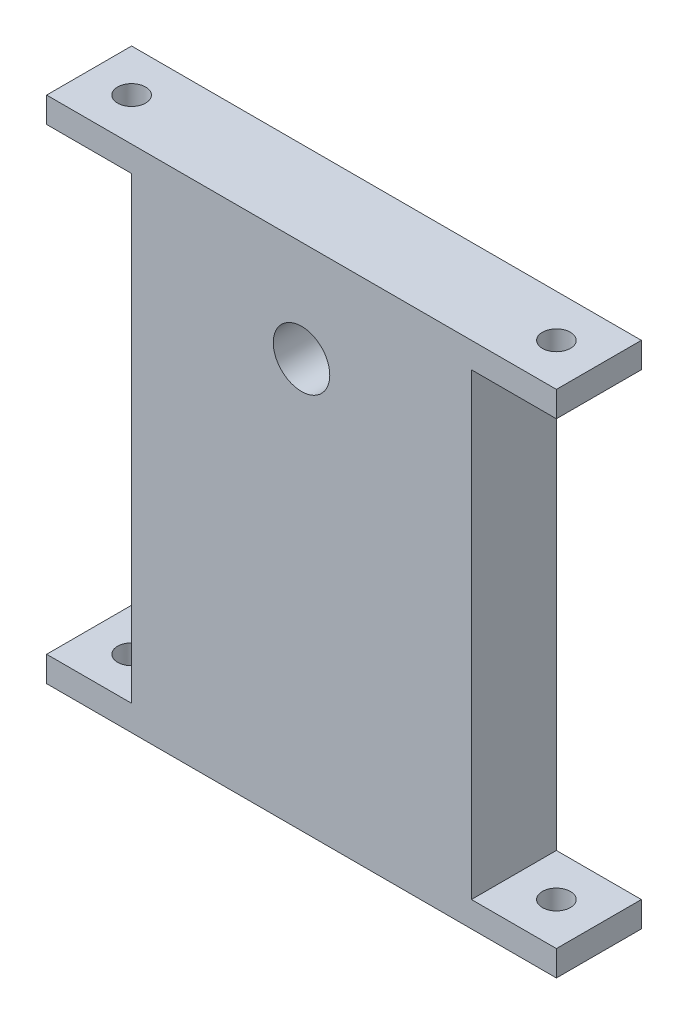
ISO-10303-21;
HEADER;
FILE_DESCRIPTION(('STEP AP214'),'2;1');
FILE_NAME('part.step','',(''),(''),'','','');
FILE_SCHEMA(('AUTOMOTIVE_DESIGN { 1 0 10303 214 1 1 1 1 }'));
ENDSEC;
DATA;
#1=APPLICATION_CONTEXT('core data for automotive mechanical design processes');
#2=APPLICATION_PROTOCOL_DEFINITION('international standard','automotive_design',2000,#1);
#3=PRODUCT_CONTEXT('',#1,'mechanical');
#4=PRODUCT('Part','Part','',(#3));
#5=PRODUCT_RELATED_PRODUCT_CATEGORY('part','',(#4));
#6=PRODUCT_DEFINITION_FORMATION('','',#4);
#7=PRODUCT_DEFINITION_CONTEXT('part definition',#1,'design');
#8=PRODUCT_DEFINITION('design','',#6,#7);
#9=PRODUCT_DEFINITION_SHAPE('','',#8);
#10=(LENGTH_UNIT() NAMED_UNIT(*) SI_UNIT(.MILLI.,.METRE.));
#11=(NAMED_UNIT(*) PLANE_ANGLE_UNIT() SI_UNIT($,.RADIAN.));
#12=(NAMED_UNIT(*) SI_UNIT($,.STERADIAN.) SOLID_ANGLE_UNIT());
#13=UNCERTAINTY_MEASURE_WITH_UNIT(LENGTH_MEASURE(1.E-05),#10,'distance_accuracy_value','');
#14=(GEOMETRIC_REPRESENTATION_CONTEXT(3) GLOBAL_UNCERTAINTY_ASSIGNED_CONTEXT((#13)) GLOBAL_UNIT_ASSIGNED_CONTEXT((#10,
#11,#12)) REPRESENTATION_CONTEXT('',''));
#15=CARTESIAN_POINT('',(0.,0.,0.));
#16=DIRECTION('',(0.,0.,1.));
#17=DIRECTION('',(1.,0.,0.));
#18=AXIS2_PLACEMENT_3D('',#15,#16,#17);
#19=CARTESIAN_POINT('',(-20.,30.,10.));
#20=DIRECTION('',(1.,0.,0.));
#21=DIRECTION('',(0.,1.,0.));
#22=AXIS2_PLACEMENT_3D('',#19,#20,#21);
#23=PLANE('',#22);
#24=DIRECTION('',(0.,0.,-1.));
#25=VECTOR('',#24,1.);
#26=CARTESIAN_POINT('',(-20.,-27.,0.));
#27=LINE('',#26,#25);
#28=CARTESIAN_POINT('',(-20.,-27.,10.));
#29=VERTEX_POINT('',#28);
#30=CARTESIAN_POINT('',(-20.,-27.,0.));
#31=VERTEX_POINT('',#30);
#32=EDGE_CURVE('E130',#29,#31,#27,.T.);
#33=ORIENTED_EDGE('',*,*,#32,.F.);
#34=DIRECTION('',(0.,-1.,0.));
#35=VECTOR('',#34,1.);
#36=CARTESIAN_POINT('',(-20.,30.,10.));
#37=LINE('',#36,#35);
#38=CARTESIAN_POINT('',(-20.,27.,10.));
#39=VERTEX_POINT('',#38);
#40=EDGE_CURVE('E48',#39,#29,#37,.T.);
#41=ORIENTED_EDGE('',*,*,#40,.F.);
#42=DIRECTION('',(0.,0.,1.));
#43=VECTOR('',#42,1.);
#44=CARTESIAN_POINT('',(-20.,27.,10.));
#45=LINE('',#44,#43);
#46=CARTESIAN_POINT('',(-20.,27.,0.));
#47=VERTEX_POINT('',#46);
#48=EDGE_CURVE('E56',#47,#39,#45,.T.);
#49=ORIENTED_EDGE('',*,*,#48,.F.);
#50=DIRECTION('',(0.,-1.,0.));
#51=VECTOR('',#50,1.);
#52=CARTESIAN_POINT('',(-20.,30.,0.));
#53=LINE('',#52,#51);
#54=EDGE_CURVE('E146',#47,#31,#53,.T.);
#55=ORIENTED_EDGE('',*,*,#54,.T.);
#56=EDGE_LOOP('',(#33,#41,#49,#55));
#57=FACE_BOUND('',#56,.T.);
#58=ADVANCED_FACE('F39',(#57),#23,.F.);
#59=CARTESIAN_POINT('',(20.,30.,10.));
#60=DIRECTION('',(-1.,0.,0.));
#61=DIRECTION('',(0.,-1.,0.));
#62=AXIS2_PLACEMENT_3D('',#59,#60,#61);
#63=PLANE('',#62);
#64=DIRECTION('',(0.,0.,1.));
#65=VECTOR('',#64,1.);
#66=CARTESIAN_POINT('',(20.,-27.,0.));
#67=LINE('',#66,#65);
#68=CARTESIAN_POINT('',(20.,-27.,0.));
#69=VERTEX_POINT('',#68);
#70=CARTESIAN_POINT('',(20.,-27.,10.));
#71=VERTEX_POINT('',#70);
#72=EDGE_CURVE('E215',#69,#71,#67,.T.);
#73=ORIENTED_EDGE('',*,*,#72,.F.);
#74=DIRECTION('',(0.,1.,0.));
#75=VECTOR('',#74,1.);
#76=CARTESIAN_POINT('',(20.,30.,0.));
#77=LINE('',#76,#75);
#78=CARTESIAN_POINT('',(20.,27.,0.));
#79=VERTEX_POINT('',#78);
#80=EDGE_CURVE('E155',#69,#79,#77,.T.);
#81=ORIENTED_EDGE('',*,*,#80,.T.);
#82=DIRECTION('',(0.,0.,-1.));
#83=VECTOR('',#82,1.);
#84=CARTESIAN_POINT('',(20.,27.,10.));
#85=LINE('',#84,#83);
#86=CARTESIAN_POINT('',(20.,27.,10.));
#87=VERTEX_POINT('',#86);
#88=EDGE_CURVE('E217',#87,#79,#85,.T.);
#89=ORIENTED_EDGE('',*,*,#88,.F.);
#90=DIRECTION('',(0.,1.,0.));
#91=VECTOR('',#90,1.);
#92=CARTESIAN_POINT('',(20.,30.,10.));
#93=LINE('',#92,#91);
#94=EDGE_CURVE('E64',#71,#87,#93,.T.);
#95=ORIENTED_EDGE('',*,*,#94,.F.);
#96=EDGE_LOOP('',(#73,#81,#89,#95));
#97=FACE_BOUND('',#96,.T.);
#98=ADVANCED_FACE('F41',(#97),#63,.F.);
#99=CARTESIAN_POINT('',(0.,0.,10.));
#100=DIRECTION('',(0.,0.,1.));
#101=DIRECTION('',(1.,0.,0.));
#102=AXIS2_PLACEMENT_3D('',#99,#100,#101);
#103=PLANE('',#102);
#104=DIRECTION('',(1.,0.,0.));
#105=VECTOR('',#104,1.);
#106=CARTESIAN_POINT('',(-20.,-30.,10.));
#107=LINE('',#106,#105);
#108=CARTESIAN_POINT('',(-30.,-30.,10.));
#109=VERTEX_POINT('',#108);
#110=CARTESIAN_POINT('',(30.,-30.,10.));
#111=VERTEX_POINT('',#110);
#112=EDGE_CURVE('E11',#109,#111,#107,.T.);
#113=ORIENTED_EDGE('',*,*,#112,.T.);
#114=DIRECTION('',(0.,-1.,0.));
#115=VECTOR('',#114,1.);
#116=CARTESIAN_POINT('',(30.,-27.,10.));
#117=LINE('',#116,#115);
#118=CARTESIAN_POINT('',(30.,-27.,10.));
#119=VERTEX_POINT('',#118);
#120=EDGE_CURVE('E214',#119,#111,#117,.T.);
#121=ORIENTED_EDGE('',*,*,#120,.F.);
#122=DIRECTION('',(-1.,0.,0.));
#123=VECTOR('',#122,1.);
#124=CARTESIAN_POINT('',(30.,-27.,10.));
#125=LINE('',#124,#123);
#126=EDGE_CURVE('E211',#119,#71,#125,.T.);
#127=ORIENTED_EDGE('',*,*,#126,.T.);
#128=ORIENTED_EDGE('',*,*,#94,.T.);
#129=DIRECTION('',(-1.,0.,0.));
#130=VECTOR('',#129,1.);
#131=CARTESIAN_POINT('',(30.,27.,10.));
#132=LINE('',#131,#130);
#133=CARTESIAN_POINT('',(30.,27.,10.));
#134=VERTEX_POINT('',#133);
#135=EDGE_CURVE('E242',#134,#87,#132,.T.);
#136=ORIENTED_EDGE('',*,*,#135,.F.);
#137=DIRECTION('',(0.,-1.,0.));
#138=VECTOR('',#137,1.);
#139=CARTESIAN_POINT('',(30.,30.,10.));
#140=LINE('',#139,#138);
#141=CARTESIAN_POINT('',(30.,30.,10.));
#142=VERTEX_POINT('',#141);
#143=EDGE_CURVE('E233',#142,#134,#140,.T.);
#144=ORIENTED_EDGE('',*,*,#143,.F.);
#145=DIRECTION('',(-1.,0.,0.));
#146=VECTOR('',#145,1.);
#147=CARTESIAN_POINT('',(-20.,30.,10.));
#148=LINE('',#147,#146);
#149=CARTESIAN_POINT('',(-30.,30.,10.));
#150=VERTEX_POINT('',#149);
#151=EDGE_CURVE('E252',#142,#150,#148,.T.);
#152=ORIENTED_EDGE('',*,*,#151,.T.);
#153=DIRECTION('',(0.,1.,0.));
#154=VECTOR('',#153,1.);
#155=CARTESIAN_POINT('',(-30.,30.,10.));
#156=LINE('',#155,#154);
#157=CARTESIAN_POINT('',(-30.,27.,10.));
#158=VERTEX_POINT('',#157);
#159=EDGE_CURVE('E196',#158,#150,#156,.T.);
#160=ORIENTED_EDGE('',*,*,#159,.F.);
#161=DIRECTION('',(1.,0.,0.));
#162=VECTOR('',#161,1.);
#163=CARTESIAN_POINT('',(-30.,27.,10.));
#164=LINE('',#163,#162);
#165=EDGE_CURVE('E202',#158,#39,#164,.T.);
#166=ORIENTED_EDGE('',*,*,#165,.T.);
#167=ORIENTED_EDGE('',*,*,#40,.T.);
#168=DIRECTION('',(1.,0.,0.));
#169=VECTOR('',#168,1.);
#170=CARTESIAN_POINT('',(-30.,-27.,10.));
#171=LINE('',#170,#169);
#172=CARTESIAN_POINT('',(-30.,-27.,10.));
#173=VERTEX_POINT('',#172);
#174=EDGE_CURVE('E137',#173,#29,#171,.T.);
#175=ORIENTED_EDGE('',*,*,#174,.F.);
#176=DIRECTION('',(0.,1.,0.));
#177=VECTOR('',#176,1.);
#178=CARTESIAN_POINT('',(-30.,-30.,10.));
#179=LINE('',#178,#177);
#180=EDGE_CURVE('E185',#109,#173,#179,.T.);
#181=ORIENTED_EDGE('',*,*,#180,.F.);
#182=EDGE_LOOP('',(#113,#121,#127,#128,#136,#144,#152,#160,#166,#167,#175,#181));
#183=FACE_BOUND('',#182,.T.);
#184=CARTESIAN_POINT('',(0.,18.11,10.));
#185=DIRECTION('',(0.,0.,1.));
#186=DIRECTION('',(1.,0.,0.));
#187=AXIS2_PLACEMENT_3D('',#184,#185,#186);
#188=CIRCLE('',#187,3.325);
#189=CARTESIAN_POINT('',(3.325,18.11,10.));
#190=VERTEX_POINT('',#189);
#191=EDGE_CURVE('E246',#190,#190,#188,.T.);
#192=ORIENTED_EDGE('',*,*,#191,.F.);
#193=EDGE_LOOP('',(#192));
#194=FACE_BOUND('',#193,.T.);
#195=ADVANCED_FACE('F267',(#183,#194),#103,.T.);
#196=CARTESIAN_POINT('',(0.,0.,0.));
#197=DIRECTION('',(0.,0.,1.));
#198=DIRECTION('',(1.,0.,0.));
#199=AXIS2_PLACEMENT_3D('',#196,#197,#198);
#200=PLANE('',#199);
#201=ORIENTED_EDGE('',*,*,#80,.F.);
#202=DIRECTION('',(-1.,0.,0.));
#203=VECTOR('',#202,1.);
#204=CARTESIAN_POINT('',(30.,-27.,0.));
#205=LINE('',#204,#203);
#206=CARTESIAN_POINT('',(30.,-27.,0.));
#207=VERTEX_POINT('',#206);
#208=EDGE_CURVE('E208',#207,#69,#205,.T.);
#209=ORIENTED_EDGE('',*,*,#208,.F.);
#210=DIRECTION('',(0.,1.,0.));
#211=VECTOR('',#210,1.);
#212=CARTESIAN_POINT('',(30.,-30.,0.));
#213=LINE('',#212,#211);
#214=CARTESIAN_POINT('',(30.,-30.,0.));
#215=VERTEX_POINT('',#214);
#216=EDGE_CURVE('E223',#215,#207,#213,.T.);
#217=ORIENTED_EDGE('',*,*,#216,.F.);
#218=DIRECTION('',(1.,0.,0.));
#219=VECTOR('',#218,1.);
#220=CARTESIAN_POINT('',(-20.,-30.,0.));
#221=LINE('',#220,#219);
#222=CARTESIAN_POINT('',(-30.,-30.,0.));
#223=VERTEX_POINT('',#222);
#224=EDGE_CURVE('E151',#223,#215,#221,.T.);
#225=ORIENTED_EDGE('',*,*,#224,.F.);
#226=DIRECTION('',(0.,-1.,0.));
#227=VECTOR('',#226,1.);
#228=CARTESIAN_POINT('',(-30.,-30.,0.));
#229=LINE('',#228,#227);
#230=CARTESIAN_POINT('',(-30.,-27.,0.));
#231=VERTEX_POINT('',#230);
#232=EDGE_CURVE('E139',#231,#223,#229,.T.);
#233=ORIENTED_EDGE('',*,*,#232,.F.);
#234=DIRECTION('',(1.,0.,0.));
#235=VECTOR('',#234,1.);
#236=CARTESIAN_POINT('',(-30.,-27.,0.));
#237=LINE('',#236,#235);
#238=EDGE_CURVE('E134',#231,#31,#237,.T.);
#239=ORIENTED_EDGE('',*,*,#238,.T.);
#240=ORIENTED_EDGE('',*,*,#54,.F.);
#241=DIRECTION('',(1.,0.,0.));
#242=VECTOR('',#241,1.);
#243=CARTESIAN_POINT('',(-30.,27.,0.));
#244=LINE('',#243,#242);
#245=CARTESIAN_POINT('',(-30.,27.,0.));
#246=VERTEX_POINT('',#245);
#247=EDGE_CURVE('E206',#246,#47,#244,.T.);
#248=ORIENTED_EDGE('',*,*,#247,.F.);
#249=DIRECTION('',(0.,-1.,0.));
#250=VECTOR('',#249,1.);
#251=CARTESIAN_POINT('',(-30.,27.,0.));
#252=LINE('',#251,#250);
#253=CARTESIAN_POINT('',(-30.,30.,0.));
#254=VERTEX_POINT('',#253);
#255=EDGE_CURVE('E191',#254,#246,#252,.T.);
#256=ORIENTED_EDGE('',*,*,#255,.F.);
#257=DIRECTION('',(-1.,0.,0.));
#258=VECTOR('',#257,1.);
#259=CARTESIAN_POINT('',(-20.,30.,0.));
#260=LINE('',#259,#258);
#261=CARTESIAN_POINT('',(30.,30.,0.));
#262=VERTEX_POINT('',#261);
#263=EDGE_CURVE('E152',#262,#254,#260,.T.);
#264=ORIENTED_EDGE('',*,*,#263,.F.);
#265=DIRECTION('',(0.,1.,0.));
#266=VECTOR('',#265,1.);
#267=CARTESIAN_POINT('',(30.,27.,0.));
#268=LINE('',#267,#266);
#269=CARTESIAN_POINT('',(30.,27.,0.));
#270=VERTEX_POINT('',#269);
#271=EDGE_CURVE('E227',#270,#262,#268,.T.);
#272=ORIENTED_EDGE('',*,*,#271,.F.);
#273=DIRECTION('',(-1.,0.,0.));
#274=VECTOR('',#273,1.);
#275=CARTESIAN_POINT('',(30.,27.,0.));
#276=LINE('',#275,#274);
#277=EDGE_CURVE('E237',#270,#79,#276,.T.);
#278=ORIENTED_EDGE('',*,*,#277,.T.);
#279=EDGE_LOOP('',(#201,#209,#217,#225,#233,#239,#240,#248,#256,#264,#272,#278));
#280=FACE_BOUND('',#279,.T.);
#281=CARTESIAN_POINT('',(0.,18.11,0.));
#282=DIRECTION('',(0.,0.,1.));
#283=DIRECTION('',(1.,0.,0.));
#284=AXIS2_PLACEMENT_3D('',#281,#282,#283);
#285=CIRCLE('',#284,3.325);
#286=CARTESIAN_POINT('',(3.325,18.11,0.));
#287=VERTEX_POINT('',#286);
#288=EDGE_CURVE('E245',#287,#287,#285,.T.);
#289=ORIENTED_EDGE('',*,*,#288,.T.);
#290=EDGE_LOOP('',(#289));
#291=FACE_BOUND('',#290,.T.);
#292=ADVANCED_FACE('F143',(#280,#291),#200,.F.);
#293=CARTESIAN_POINT('',(-20.,30.,10.));
#294=DIRECTION('',(0.,-1.,0.));
#295=DIRECTION('',(0.,0.,-1.));
#296=AXIS2_PLACEMENT_3D('',#293,#294,#295);
#297=PLANE('',#296);
#298=CARTESIAN_POINT('',(-25.,30.,5.));
#299=DIRECTION('',(0.,-1.,0.));
#300=DIRECTION('',(1.,0.,0.));
#301=AXIS2_PLACEMENT_3D('',#298,#299,#300);
#302=CIRCLE('',#301,1.65);
#303=CARTESIAN_POINT('',(-23.35,30.,5.));
#304=VERTEX_POINT('',#303);
#305=EDGE_CURVE('E161',#304,#304,#302,.T.);
#306=ORIENTED_EDGE('',*,*,#305,.T.);
#307=EDGE_LOOP('',(#306));
#308=FACE_BOUND('',#307,.T.);
#309=CARTESIAN_POINT('',(25.,30.,5.));
#310=DIRECTION('',(0.,-1.,0.));
#311=DIRECTION('',(-1.,0.,0.));
#312=AXIS2_PLACEMENT_3D('',#309,#310,#311);
#313=CIRCLE('',#312,1.65);
#314=CARTESIAN_POINT('',(23.35,30.,5.));
#315=VERTEX_POINT('',#314);
#316=EDGE_CURVE('E175',#315,#315,#313,.T.);
#317=ORIENTED_EDGE('',*,*,#316,.T.);
#318=EDGE_LOOP('',(#317));
#319=FACE_BOUND('',#318,.T.);
#320=ORIENTED_EDGE('',*,*,#263,.T.);
#321=DIRECTION('',(0.,0.,-1.));
#322=VECTOR('',#321,1.);
#323=CARTESIAN_POINT('',(-30.,30.,0.));
#324=LINE('',#323,#322);
#325=EDGE_CURVE('E199',#150,#254,#324,.T.);
#326=ORIENTED_EDGE('',*,*,#325,.F.);
#327=ORIENTED_EDGE('',*,*,#151,.F.);
#328=DIRECTION('',(0.,0.,1.));
#329=VECTOR('',#328,1.);
#330=CARTESIAN_POINT('',(30.,30.,0.));
#331=LINE('',#330,#329);
#332=EDGE_CURVE('E230',#262,#142,#331,.T.);
#333=ORIENTED_EDGE('',*,*,#332,.F.);
#334=EDGE_LOOP('',(#320,#326,#327,#333));
#335=FACE_BOUND('',#334,.T.);
#336=ADVANCED_FACE('F292',(#308,#319,#335),#297,.F.);
#337=CARTESIAN_POINT('',(-20.,-30.,10.));
#338=DIRECTION('',(0.,1.,0.));
#339=DIRECTION('',(-1.,0.,0.));
#340=AXIS2_PLACEMENT_3D('',#337,#338,#339);
#341=PLANE('',#340);
#342=CARTESIAN_POINT('',(-25.,-30.,5.));
#343=DIRECTION('',(0.,-1.,0.));
#344=DIRECTION('',(1.,0.,0.));
#345=AXIS2_PLACEMENT_3D('',#342,#343,#344);
#346=CIRCLE('',#345,1.65);
#347=CARTESIAN_POINT('',(-23.35,-30.,5.));
#348=VERTEX_POINT('',#347);
#349=EDGE_CURVE('E167',#348,#348,#346,.T.);
#350=ORIENTED_EDGE('',*,*,#349,.F.);
#351=EDGE_LOOP('',(#350));
#352=FACE_BOUND('',#351,.T.);
#353=CARTESIAN_POINT('',(25.,-30.,5.));
#354=DIRECTION('',(0.,-1.,0.));
#355=DIRECTION('',(-1.,0.,0.));
#356=AXIS2_PLACEMENT_3D('',#353,#354,#355);
#357=CIRCLE('',#356,1.65);
#358=CARTESIAN_POINT('',(23.35,-30.,5.));
#359=VERTEX_POINT('',#358);
#360=EDGE_CURVE('E172',#359,#359,#357,.T.);
#361=ORIENTED_EDGE('',*,*,#360,.F.);
#362=EDGE_LOOP('',(#361));
#363=FACE_BOUND('',#362,.T.);
#364=ORIENTED_EDGE('',*,*,#224,.T.);
#365=DIRECTION('',(0.,0.,-1.));
#366=VECTOR('',#365,1.);
#367=CARTESIAN_POINT('',(30.,-30.,10.));
#368=LINE('',#367,#366);
#369=EDGE_CURVE('E218',#111,#215,#368,.T.);
#370=ORIENTED_EDGE('',*,*,#369,.F.);
#371=ORIENTED_EDGE('',*,*,#112,.F.);
#372=DIRECTION('',(0.,0.,1.));
#373=VECTOR('',#372,1.);
#374=CARTESIAN_POINT('',(-30.,-30.,0.));
#375=LINE('',#374,#373);
#376=EDGE_CURVE('E187',#223,#109,#375,.T.);
#377=ORIENTED_EDGE('',*,*,#376,.F.);
#378=EDGE_LOOP('',(#364,#370,#371,#377));
#379=FACE_BOUND('',#378,.T.);
#380=ADVANCED_FACE('F280',(#352,#363,#379),#341,.F.);
#381=CARTESIAN_POINT('',(0.,18.11,10.));
#382=DIRECTION('',(0.,0.,-1.));
#383=DIRECTION('',(-1.,0.,0.));
#384=AXIS2_PLACEMENT_3D('',#381,#382,#383);
#385=CYLINDRICAL_SURFACE('',#384,3.325);
#386=ORIENTED_EDGE('',*,*,#191,.T.);
#387=EDGE_LOOP('',(#386));
#388=FACE_BOUND('',#387,.T.);
#389=ORIENTED_EDGE('',*,*,#288,.F.);
#390=EDGE_LOOP('',(#389));
#391=FACE_BOUND('',#390,.T.);
#392=ADVANCED_FACE('F298',(#388,#391),#385,.F.);
#393=CARTESIAN_POINT('',(30.,27.,10.));
#394=DIRECTION('',(0.,1.,0.));
#395=DIRECTION('',(-1.,0.,0.));
#396=AXIS2_PLACEMENT_3D('',#393,#394,#395);
#397=PLANE('',#396);
#398=CARTESIAN_POINT('',(25.,27.,5.));
#399=DIRECTION('',(0.,1.,0.));
#400=DIRECTION('',(-1.,0.,0.));
#401=AXIS2_PLACEMENT_3D('',#398,#399,#400);
#402=CIRCLE('',#401,1.65);
#403=CARTESIAN_POINT('',(23.35,27.,5.));
#404=VERTEX_POINT('',#403);
#405=EDGE_CURVE('E180',#404,#404,#402,.T.);
#406=ORIENTED_EDGE('',*,*,#405,.T.);
#407=EDGE_LOOP('',(#406));
#408=FACE_BOUND('',#407,.T.);
#409=ORIENTED_EDGE('',*,*,#88,.T.);
#410=ORIENTED_EDGE('',*,*,#277,.F.);
#411=DIRECTION('',(0.,0.,-1.));
#412=VECTOR('',#411,1.);
#413=CARTESIAN_POINT('',(30.,27.,10.));
#414=LINE('',#413,#412);
#415=EDGE_CURVE('E235',#134,#270,#414,.T.);
#416=ORIENTED_EDGE('',*,*,#415,.F.);
#417=ORIENTED_EDGE('',*,*,#135,.T.);
#418=EDGE_LOOP('',(#409,#410,#416,#417));
#419=FACE_BOUND('',#418,.T.);
#420=ADVANCED_FACE('F257',(#408,#419),#397,.F.);
#421=CARTESIAN_POINT('',(30.,0.,0.));
#422=DIRECTION('',(1.,0.,0.));
#423=DIRECTION('',(0.,0.,-1.));
#424=AXIS2_PLACEMENT_3D('',#421,#422,#423);
#425=PLANE('',#424);
#426=ORIENTED_EDGE('',*,*,#271,.T.);
#427=ORIENTED_EDGE('',*,*,#332,.T.);
#428=ORIENTED_EDGE('',*,*,#143,.T.);
#429=ORIENTED_EDGE('',*,*,#415,.T.);
#430=EDGE_LOOP('',(#426,#427,#428,#429));
#431=FACE_BOUND('',#430,.T.);
#432=ADVANCED_FACE('F264',(#431),#425,.T.);
#433=CARTESIAN_POINT('',(30.,-27.,0.));
#434=DIRECTION('',(0.,-1.,0.));
#435=DIRECTION('',(1.,0.,0.));
#436=AXIS2_PLACEMENT_3D('',#433,#434,#435);
#437=PLANE('',#436);
#438=CARTESIAN_POINT('',(25.,-27.,5.));
#439=DIRECTION('',(0.,-1.,0.));
#440=DIRECTION('',(1.,0.,0.));
#441=AXIS2_PLACEMENT_3D('',#438,#439,#440);
#442=CIRCLE('',#441,1.65);
#443=CARTESIAN_POINT('',(26.65,-27.,5.));
#444=VERTEX_POINT('',#443);
#445=EDGE_CURVE('E43',#444,#444,#442,.T.);
#446=ORIENTED_EDGE('',*,*,#445,.T.);
#447=EDGE_LOOP('',(#446));
#448=FACE_BOUND('',#447,.T.);
#449=ORIENTED_EDGE('',*,*,#72,.T.);
#450=ORIENTED_EDGE('',*,*,#126,.F.);
#451=DIRECTION('',(0.,0.,1.));
#452=VECTOR('',#451,1.);
#453=CARTESIAN_POINT('',(30.,-27.,0.));
#454=LINE('',#453,#452);
#455=EDGE_CURVE('E221',#207,#119,#454,.T.);
#456=ORIENTED_EDGE('',*,*,#455,.F.);
#457=ORIENTED_EDGE('',*,*,#208,.T.);
#458=EDGE_LOOP('',(#449,#450,#456,#457));
#459=FACE_BOUND('',#458,.T.);
#460=ADVANCED_FACE('F273',(#448,#459),#437,.F.);
#461=CARTESIAN_POINT('',(30.,0.,0.));
#462=DIRECTION('',(1.,0.,0.));
#463=DIRECTION('',(0.,0.,-1.));
#464=AXIS2_PLACEMENT_3D('',#461,#462,#463);
#465=PLANE('',#464);
#466=ORIENTED_EDGE('',*,*,#369,.T.);
#467=ORIENTED_EDGE('',*,*,#216,.T.);
#468=ORIENTED_EDGE('',*,*,#455,.T.);
#469=ORIENTED_EDGE('',*,*,#120,.T.);
#470=EDGE_LOOP('',(#466,#467,#468,#469));
#471=FACE_BOUND('',#470,.T.);
#472=ADVANCED_FACE('F278',(#471),#465,.T.);
#473=CARTESIAN_POINT('',(-30.,27.,10.));
#474=DIRECTION('',(0.,1.,0.));
#475=DIRECTION('',(-1.,0.,0.));
#476=AXIS2_PLACEMENT_3D('',#473,#474,#475);
#477=PLANE('',#476);
#478=CARTESIAN_POINT('',(-25.,27.,5.));
#479=DIRECTION('',(0.,1.,0.));
#480=DIRECTION('',(-1.,0.,0.));
#481=AXIS2_PLACEMENT_3D('',#478,#479,#480);
#482=CIRCLE('',#481,1.65);
#483=CARTESIAN_POINT('',(-26.65,27.,5.));
#484=VERTEX_POINT('',#483);
#485=EDGE_CURVE('E160',#484,#484,#482,.T.);
#486=ORIENTED_EDGE('',*,*,#485,.T.);
#487=EDGE_LOOP('',(#486));
#488=FACE_BOUND('',#487,.T.);
#489=ORIENTED_EDGE('',*,*,#48,.T.);
#490=ORIENTED_EDGE('',*,*,#165,.F.);
#491=DIRECTION('',(0.,0.,1.));
#492=VECTOR('',#491,1.);
#493=CARTESIAN_POINT('',(-30.,27.,10.));
#494=LINE('',#493,#492);
#495=EDGE_CURVE('E194',#246,#158,#494,.T.);
#496=ORIENTED_EDGE('',*,*,#495,.F.);
#497=ORIENTED_EDGE('',*,*,#247,.T.);
#498=EDGE_LOOP('',(#489,#490,#496,#497));
#499=FACE_BOUND('',#498,.T.);
#500=ADVANCED_FACE('F287',(#488,#499),#477,.F.);
#501=CARTESIAN_POINT('',(-30.,0.,0.));
#502=DIRECTION('',(1.,0.,0.));
#503=DIRECTION('',(0.,0.,-1.));
#504=AXIS2_PLACEMENT_3D('',#501,#502,#503);
#505=PLANE('',#504);
#506=ORIENTED_EDGE('',*,*,#255,.T.);
#507=ORIENTED_EDGE('',*,*,#495,.T.);
#508=ORIENTED_EDGE('',*,*,#159,.T.);
#509=ORIENTED_EDGE('',*,*,#325,.T.);
#510=EDGE_LOOP('',(#506,#507,#508,#509));
#511=FACE_BOUND('',#510,.T.);
#512=ADVANCED_FACE('F289',(#511),#505,.F.);
#513=CARTESIAN_POINT('',(-30.,-27.,0.));
#514=DIRECTION('',(0.,-1.,0.));
#515=DIRECTION('',(1.,0.,0.));
#516=AXIS2_PLACEMENT_3D('',#513,#514,#515);
#517=PLANE('',#516);
#518=CARTESIAN_POINT('',(-25.,-27.,5.));
#519=DIRECTION('',(0.,-1.,0.));
#520=DIRECTION('',(1.,0.,0.));
#521=AXIS2_PLACEMENT_3D('',#518,#519,#520);
#522=CIRCLE('',#521,1.65);
#523=CARTESIAN_POINT('',(-23.35,-27.,5.));
#524=VERTEX_POINT('',#523);
#525=EDGE_CURVE('E158',#524,#524,#522,.T.);
#526=ORIENTED_EDGE('',*,*,#525,.T.);
#527=EDGE_LOOP('',(#526));
#528=FACE_BOUND('',#527,.T.);
#529=ORIENTED_EDGE('',*,*,#32,.T.);
#530=ORIENTED_EDGE('',*,*,#238,.F.);
#531=DIRECTION('',(0.,0.,-1.));
#532=VECTOR('',#531,1.);
#533=CARTESIAN_POINT('',(-30.,-27.,0.));
#534=LINE('',#533,#532);
#535=EDGE_CURVE('E149',#173,#231,#534,.T.);
#536=ORIENTED_EDGE('',*,*,#535,.F.);
#537=ORIENTED_EDGE('',*,*,#174,.T.);
#538=EDGE_LOOP('',(#529,#530,#536,#537));
#539=FACE_BOUND('',#538,.T.);
#540=ADVANCED_FACE('F132',(#528,#539),#517,.F.);
#541=CARTESIAN_POINT('',(-30.,0.,0.));
#542=DIRECTION('',(1.,0.,0.));
#543=DIRECTION('',(0.,0.,-1.));
#544=AXIS2_PLACEMENT_3D('',#541,#542,#543);
#545=PLANE('',#544);
#546=ORIENTED_EDGE('',*,*,#232,.T.);
#547=ORIENTED_EDGE('',*,*,#376,.T.);
#548=ORIENTED_EDGE('',*,*,#180,.T.);
#549=ORIENTED_EDGE('',*,*,#535,.T.);
#550=EDGE_LOOP('',(#546,#547,#548,#549));
#551=FACE_BOUND('',#550,.T.);
#552=ADVANCED_FACE('F283',(#551),#545,.F.);
#553=CARTESIAN_POINT('',(-25.,30.,5.));
#554=DIRECTION('',(0.,-1.,0.));
#555=DIRECTION('',(1.,0.,0.));
#556=AXIS2_PLACEMENT_3D('',#553,#554,#555);
#557=CYLINDRICAL_SURFACE('',#556,1.65);
#558=ORIENTED_EDGE('',*,*,#349,.T.);
#559=EDGE_LOOP('',(#558));
#560=FACE_BOUND('',#559,.T.);
#561=ORIENTED_EDGE('',*,*,#525,.F.);
#562=EDGE_LOOP('',(#561));
#563=FACE_BOUND('',#562,.T.);
#564=ADVANCED_FACE('F331',(#560,#563),#557,.F.);
#565=ORIENTED_EDGE('',*,*,#305,.F.);
#566=EDGE_LOOP('',(#565));
#567=FACE_BOUND('',#566,.T.);
#568=ORIENTED_EDGE('',*,*,#485,.F.);
#569=EDGE_LOOP('',(#568));
#570=FACE_BOUND('',#569,.T.);
#571=ADVANCED_FACE('F339',(#567,#570),#557,.F.);
#572=CARTESIAN_POINT('',(25.,30.,5.));
#573=DIRECTION('',(0.,-1.,0.));
#574=DIRECTION('',(1.,0.,0.));
#575=AXIS2_PLACEMENT_3D('',#572,#573,#574);
#576=CYLINDRICAL_SURFACE('',#575,1.65);
#577=ORIENTED_EDGE('',*,*,#360,.T.);
#578=EDGE_LOOP('',(#577));
#579=FACE_BOUND('',#578,.T.);
#580=ORIENTED_EDGE('',*,*,#445,.F.);
#581=EDGE_LOOP('',(#580));
#582=FACE_BOUND('',#581,.T.);
#583=ADVANCED_FACE('F337',(#579,#582),#576,.F.);
#584=ORIENTED_EDGE('',*,*,#316,.F.);
#585=EDGE_LOOP('',(#584));
#586=FACE_BOUND('',#585,.T.);
#587=ORIENTED_EDGE('',*,*,#405,.F.);
#588=EDGE_LOOP('',(#587));
#589=FACE_BOUND('',#588,.T.);
#590=ADVANCED_FACE('F334',(#586,#589),#576,.F.);
#591=CLOSED_SHELL('',(#58,#98,#195,#292,#336,#380,#392,#420,#432,#460,#472,#500,#512,#540,#552,
#564,#571,#583,#590));
#592=MANIFOLD_SOLID_BREP('B2',#591);
#593=ADVANCED_BREP_SHAPE_REPRESENTATION('',(#18,#592),#14);
#594=SHAPE_DEFINITION_REPRESENTATION(#9,#593);
ENDSEC;
END-ISO-10303-21;
